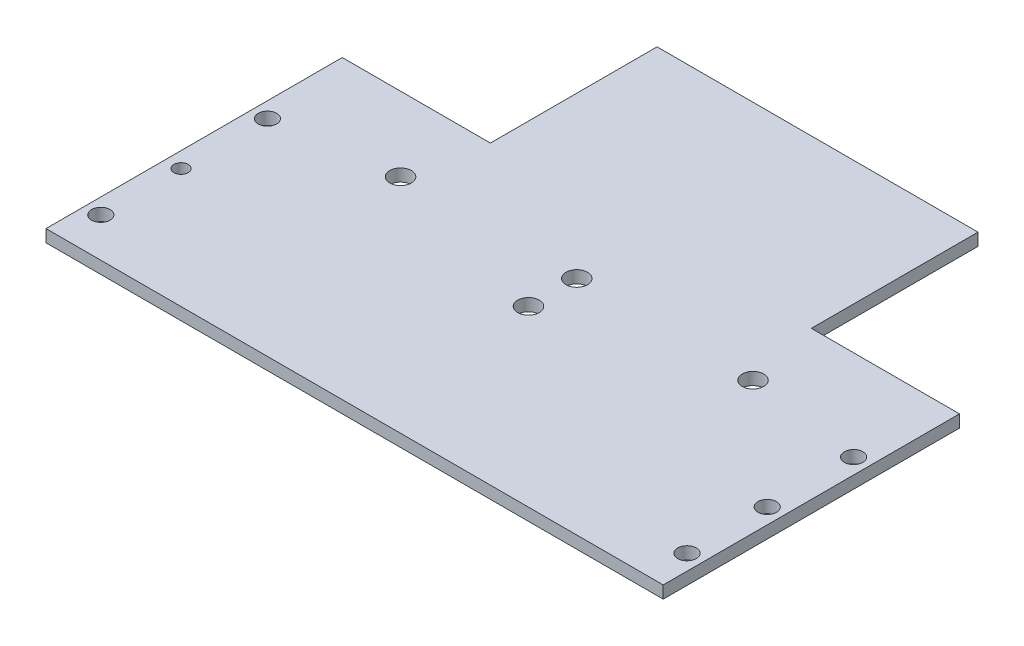
ISO-10303-21;
HEADER;
FILE_DESCRIPTION(('STEP AP214'),'2;1');
FILE_NAME('part.step','',(''),(''),'','','');
FILE_SCHEMA(('AUTOMOTIVE_DESIGN { 1 0 10303 214 1 1 1 1 }'));
ENDSEC;
DATA;
#1=APPLICATION_CONTEXT('core data for automotive mechanical design processes');
#2=APPLICATION_PROTOCOL_DEFINITION('international standard','automotive_design',2000,#1);
#3=PRODUCT_CONTEXT('',#1,'mechanical');
#4=PRODUCT('Part','Part','',(#3));
#5=PRODUCT_RELATED_PRODUCT_CATEGORY('part','',(#4));
#6=PRODUCT_DEFINITION_FORMATION('','',#4);
#7=PRODUCT_DEFINITION_CONTEXT('part definition',#1,'design');
#8=PRODUCT_DEFINITION('design','',#6,#7);
#9=PRODUCT_DEFINITION_SHAPE('','',#8);
#10=(LENGTH_UNIT() NAMED_UNIT(*) SI_UNIT(.MILLI.,.METRE.));
#11=(NAMED_UNIT(*) PLANE_ANGLE_UNIT() SI_UNIT($,.RADIAN.));
#12=(NAMED_UNIT(*) SI_UNIT($,.STERADIAN.) SOLID_ANGLE_UNIT());
#13=UNCERTAINTY_MEASURE_WITH_UNIT(LENGTH_MEASURE(1.E-05),#10,'distance_accuracy_value','');
#14=(GEOMETRIC_REPRESENTATION_CONTEXT(3) GLOBAL_UNCERTAINTY_ASSIGNED_CONTEXT((#13)) GLOBAL_UNIT_ASSIGNED_CONTEXT((#10,
#11,#12)) REPRESENTATION_CONTEXT('',''));
#15=CARTESIAN_POINT('',(0.,0.,0.));
#16=DIRECTION('',(0.,0.,1.));
#17=DIRECTION('',(1.,0.,0.));
#18=AXIS2_PLACEMENT_3D('',#15,#16,#17);
#19=CARTESIAN_POINT('',(50.,2.,0.));
#20=DIRECTION('',(1.,0.,0.));
#21=DIRECTION('',(0.,0.,-1.));
#22=AXIS2_PLACEMENT_3D('',#19,#20,#21);
#23=PLANE('',#22);
#24=DIRECTION('',(0.,0.,1.));
#25=VECTOR('',#24,1.);
#26=CARTESIAN_POINT('',(50.,0.,0.));
#27=LINE('',#26,#25);
#28=CARTESIAN_POINT('',(50.,0.,-10.5));
#29=VERTEX_POINT('',#28);
#30=CARTESIAN_POINT('',(50.,0.,37.5));
#31=VERTEX_POINT('',#30);
#32=EDGE_CURVE('E164',#29,#31,#27,.T.);
#33=ORIENTED_EDGE('',*,*,#32,.F.);
#34=DIRECTION('',(0.,-1.,0.));
#35=VECTOR('',#34,1.);
#36=CARTESIAN_POINT('',(50.,2.,-10.5));
#37=LINE('',#36,#35);
#38=CARTESIAN_POINT('',(50.,2.,-10.5));
#39=VERTEX_POINT('',#38);
#40=EDGE_CURVE('E11',#39,#29,#37,.T.);
#41=ORIENTED_EDGE('',*,*,#40,.F.);
#42=DIRECTION('',(0.,0.,1.));
#43=VECTOR('',#42,1.);
#44=CARTESIAN_POINT('',(50.,2.,0.));
#45=LINE('',#44,#43);
#46=CARTESIAN_POINT('',(50.,2.,37.5));
#47=VERTEX_POINT('',#46);
#48=EDGE_CURVE('E422',#39,#47,#45,.T.);
#49=ORIENTED_EDGE('',*,*,#48,.T.);
#50=DIRECTION('',(0.,-1.,0.));
#51=VECTOR('',#50,1.);
#52=CARTESIAN_POINT('',(50.,2.,37.5));
#53=LINE('',#52,#51);
#54=EDGE_CURVE('E87',#47,#31,#53,.T.);
#55=ORIENTED_EDGE('',*,*,#54,.T.);
#56=EDGE_LOOP('',(#33,#41,#49,#55));
#57=FACE_BOUND('',#56,.T.);
#58=ADVANCED_FACE('F35',(#57),#23,.T.);
#59=CARTESIAN_POINT('',(0.,2.,-10.5));
#60=DIRECTION('',(0.,0.,1.));
#61=DIRECTION('',(1.,0.,0.));
#62=AXIS2_PLACEMENT_3D('',#59,#60,#61);
#63=PLANE('',#62);
#64=DIRECTION('',(-1.,0.,0.));
#65=VECTOR('',#64,1.);
#66=CARTESIAN_POINT('',(0.,0.,-10.5));
#67=LINE('',#66,#65);
#68=CARTESIAN_POINT('',(26.,0.,-10.5));
#69=VERTEX_POINT('',#68);
#70=EDGE_CURVE('E166',#29,#69,#67,.T.);
#71=ORIENTED_EDGE('',*,*,#70,.T.);
#72=DIRECTION('',(0.,-1.,0.));
#73=VECTOR('',#72,1.);
#74=CARTESIAN_POINT('',(26.,2.,-10.5));
#75=LINE('',#74,#73);
#76=CARTESIAN_POINT('',(26.,2.,-10.5));
#77=VERTEX_POINT('',#76);
#78=EDGE_CURVE('E44',#77,#69,#75,.T.);
#79=ORIENTED_EDGE('',*,*,#78,.F.);
#80=DIRECTION('',(-1.,0.,0.));
#81=VECTOR('',#80,1.);
#82=CARTESIAN_POINT('',(0.,2.,-10.5));
#83=LINE('',#82,#81);
#84=EDGE_CURVE('E418',#39,#77,#83,.T.);
#85=ORIENTED_EDGE('',*,*,#84,.F.);
#86=ORIENTED_EDGE('',*,*,#40,.T.);
#87=EDGE_LOOP('',(#71,#79,#85,#86));
#88=FACE_BOUND('',#87,.T.);
#89=ADVANCED_FACE('F198',(#88),#63,.F.);
#90=CARTESIAN_POINT('',(26.,2.,0.));
#91=DIRECTION('',(-1.,0.,0.));
#92=DIRECTION('',(0.,0.,1.));
#93=AXIS2_PLACEMENT_3D('',#90,#91,#92);
#94=PLANE('',#93);
#95=DIRECTION('',(0.,0.,-1.));
#96=VECTOR('',#95,1.);
#97=CARTESIAN_POINT('',(26.,0.,0.));
#98=LINE('',#97,#96);
#99=CARTESIAN_POINT('',(26.,0.,-37.5));
#100=VERTEX_POINT('',#99);
#101=EDGE_CURVE('E169',#69,#100,#98,.T.);
#102=ORIENTED_EDGE('',*,*,#101,.T.);
#103=DIRECTION('',(0.,-1.,0.));
#104=VECTOR('',#103,1.);
#105=CARTESIAN_POINT('',(26.,2.,-37.5));
#106=LINE('',#105,#104);
#107=CARTESIAN_POINT('',(26.,2.,-37.5));
#108=VERTEX_POINT('',#107);
#109=EDGE_CURVE('E188',#108,#100,#106,.T.);
#110=ORIENTED_EDGE('',*,*,#109,.F.);
#111=DIRECTION('',(0.,0.,-1.));
#112=VECTOR('',#111,1.);
#113=CARTESIAN_POINT('',(26.,2.,0.));
#114=LINE('',#113,#112);
#115=EDGE_CURVE('E194',#77,#108,#114,.T.);
#116=ORIENTED_EDGE('',*,*,#115,.F.);
#117=ORIENTED_EDGE('',*,*,#78,.T.);
#118=EDGE_LOOP('',(#102,#110,#116,#117));
#119=FACE_BOUND('',#118,.T.);
#120=ADVANCED_FACE('F192',(#119),#94,.F.);
#121=CARTESIAN_POINT('',(0.,2.,-37.5));
#122=DIRECTION('',(0.,0.,-1.));
#123=DIRECTION('',(-1.,0.,0.));
#124=AXIS2_PLACEMENT_3D('',#121,#122,#123);
#125=PLANE('',#124);
#126=DIRECTION('',(1.,0.,0.));
#127=VECTOR('',#126,1.);
#128=CARTESIAN_POINT('',(0.,0.,-37.5));
#129=LINE('',#128,#127);
#130=CARTESIAN_POINT('',(-26.,0.,-37.5));
#131=VERTEX_POINT('',#130);
#132=EDGE_CURVE('E172',#131,#100,#129,.T.);
#133=ORIENTED_EDGE('',*,*,#132,.F.);
#134=DIRECTION('',(0.,-1.,0.));
#135=VECTOR('',#134,1.);
#136=CARTESIAN_POINT('',(-26.,2.,-37.5));
#137=LINE('',#136,#135);
#138=CARTESIAN_POINT('',(-26.,2.,-37.5));
#139=VERTEX_POINT('',#138);
#140=EDGE_CURVE('E186',#139,#131,#137,.T.);
#141=ORIENTED_EDGE('',*,*,#140,.F.);
#142=DIRECTION('',(1.,0.,0.));
#143=VECTOR('',#142,1.);
#144=CARTESIAN_POINT('',(0.,2.,-37.5));
#145=LINE('',#144,#143);
#146=EDGE_CURVE('E129',#139,#108,#145,.T.);
#147=ORIENTED_EDGE('',*,*,#146,.T.);
#148=ORIENTED_EDGE('',*,*,#109,.T.);
#149=EDGE_LOOP('',(#133,#141,#147,#148));
#150=FACE_BOUND('',#149,.T.);
#151=ADVANCED_FACE('F296',(#150),#125,.T.);
#152=CARTESIAN_POINT('',(-26.,2.,0.));
#153=DIRECTION('',(-1.,0.,0.));
#154=DIRECTION('',(0.,0.,1.));
#155=AXIS2_PLACEMENT_3D('',#152,#153,#154);
#156=PLANE('',#155);
#157=DIRECTION('',(0.,0.,-1.));
#158=VECTOR('',#157,1.);
#159=CARTESIAN_POINT('',(-26.,0.,0.));
#160=LINE('',#159,#158);
#161=CARTESIAN_POINT('',(-26.,0.,-10.5));
#162=VERTEX_POINT('',#161);
#163=EDGE_CURVE('E175',#162,#131,#160,.T.);
#164=ORIENTED_EDGE('',*,*,#163,.F.);
#165=DIRECTION('',(0.,-1.,0.));
#166=VECTOR('',#165,1.);
#167=CARTESIAN_POINT('',(-26.,2.,-10.5));
#168=LINE('',#167,#166);
#169=CARTESIAN_POINT('',(-26.,2.,-10.5));
#170=VERTEX_POINT('',#169);
#171=EDGE_CURVE('E116',#170,#162,#168,.T.);
#172=ORIENTED_EDGE('',*,*,#171,.F.);
#173=DIRECTION('',(0.,0.,-1.));
#174=VECTOR('',#173,1.);
#175=CARTESIAN_POINT('',(-26.,2.,0.));
#176=LINE('',#175,#174);
#177=EDGE_CURVE('E127',#170,#139,#176,.T.);
#178=ORIENTED_EDGE('',*,*,#177,.T.);
#179=ORIENTED_EDGE('',*,*,#140,.T.);
#180=EDGE_LOOP('',(#164,#172,#178,#179));
#181=FACE_BOUND('',#180,.T.);
#182=ADVANCED_FACE('F293',(#181),#156,.T.);
#183=CARTESIAN_POINT('',(0.,2.,-10.5));
#184=DIRECTION('',(0.,0.,-1.));
#185=DIRECTION('',(-1.,0.,0.));
#186=AXIS2_PLACEMENT_3D('',#183,#184,#185);
#187=PLANE('',#186);
#188=DIRECTION('',(1.,0.,0.));
#189=VECTOR('',#188,1.);
#190=CARTESIAN_POINT('',(0.,0.,-10.5));
#191=LINE('',#190,#189);
#192=CARTESIAN_POINT('',(-50.,0.,-10.5));
#193=VERTEX_POINT('',#192);
#194=EDGE_CURVE('E113',#193,#162,#191,.T.);
#195=ORIENTED_EDGE('',*,*,#194,.F.);
#196=DIRECTION('',(0.,-1.,0.));
#197=VECTOR('',#196,1.);
#198=CARTESIAN_POINT('',(-50.,2.,-10.5));
#199=LINE('',#198,#197);
#200=CARTESIAN_POINT('',(-50.,2.,-10.5));
#201=VERTEX_POINT('',#200);
#202=EDGE_CURVE('E107',#201,#193,#199,.T.);
#203=ORIENTED_EDGE('',*,*,#202,.F.);
#204=DIRECTION('',(1.,0.,0.));
#205=VECTOR('',#204,1.);
#206=CARTESIAN_POINT('',(0.,2.,-10.5));
#207=LINE('',#206,#205);
#208=EDGE_CURVE('E111',#201,#170,#207,.T.);
#209=ORIENTED_EDGE('',*,*,#208,.T.);
#210=ORIENTED_EDGE('',*,*,#171,.T.);
#211=EDGE_LOOP('',(#195,#203,#209,#210));
#212=FACE_BOUND('',#211,.T.);
#213=ADVANCED_FACE('F109',(#212),#187,.T.);
#214=CARTESIAN_POINT('',(-50.,2.,0.));
#215=DIRECTION('',(1.,0.,0.));
#216=DIRECTION('',(0.,0.,-1.));
#217=AXIS2_PLACEMENT_3D('',#214,#215,#216);
#218=PLANE('',#217);
#219=DIRECTION('',(0.,0.,1.));
#220=VECTOR('',#219,1.);
#221=CARTESIAN_POINT('',(-50.,0.,0.));
#222=LINE('',#221,#220);
#223=CARTESIAN_POINT('',(-50.,0.,37.5));
#224=VERTEX_POINT('',#223);
#225=EDGE_CURVE('E179',#193,#224,#222,.T.);
#226=ORIENTED_EDGE('',*,*,#225,.T.);
#227=DIRECTION('',(0.,-1.,0.));
#228=VECTOR('',#227,1.);
#229=CARTESIAN_POINT('',(-50.,2.,37.5));
#230=LINE('',#229,#228);
#231=CARTESIAN_POINT('',(-50.,2.,37.5));
#232=VERTEX_POINT('',#231);
#233=EDGE_CURVE('E117',#232,#224,#230,.T.);
#234=ORIENTED_EDGE('',*,*,#233,.F.);
#235=DIRECTION('',(0.,0.,1.));
#236=VECTOR('',#235,1.);
#237=CARTESIAN_POINT('',(-50.,2.,0.));
#238=LINE('',#237,#236);
#239=EDGE_CURVE('E120',#201,#232,#238,.T.);
#240=ORIENTED_EDGE('',*,*,#239,.F.);
#241=ORIENTED_EDGE('',*,*,#202,.T.);
#242=EDGE_LOOP('',(#226,#234,#240,#241));
#243=FACE_BOUND('',#242,.T.);
#244=ADVANCED_FACE('F121',(#243),#218,.F.);
#245=CARTESIAN_POINT('',(28.5500000000003,2.,1.50405140920961));
#246=DIRECTION('',(0.,-1.,0.));
#247=DIRECTION('',(0.,0.,-1.));
#248=AXIS2_PLACEMENT_3D('',#245,#246,#247);
#249=CYLINDRICAL_SURFACE('',#248,1.75);
#250=CARTESIAN_POINT('',(28.5500000000003,2.,1.50405140920961));
#251=DIRECTION('',(0.,1.,0.));
#252=DIRECTION('',(0.,0.,1.));
#253=AXIS2_PLACEMENT_3D('',#250,#251,#252);
#254=CIRCLE('',#253,1.75);
#255=CARTESIAN_POINT('',(28.5500000000003,2.,3.25405140920961));
#256=VERTEX_POINT('',#255);
#257=EDGE_CURVE('E424',#256,#256,#254,.T.);
#258=ORIENTED_EDGE('',*,*,#257,.T.);
#259=EDGE_LOOP('',(#258));
#260=FACE_BOUND('',#259,.T.);
#261=CARTESIAN_POINT('',(28.5500000000003,0.,1.50405140920961));
#262=DIRECTION('',(0.,1.,0.));
#263=DIRECTION('',(0.,0.,1.));
#264=AXIS2_PLACEMENT_3D('',#261,#262,#263);
#265=CIRCLE('',#264,1.75);
#266=CARTESIAN_POINT('',(28.5500000000003,0.,3.25405140920961));
#267=VERTEX_POINT('',#266);
#268=EDGE_CURVE('E161',#267,#267,#265,.T.);
#269=ORIENTED_EDGE('',*,*,#268,.F.);
#270=EDGE_LOOP('',(#269));
#271=FACE_BOUND('',#270,.T.);
#272=ADVANCED_FACE('F208',(#260,#271),#249,.F.);
#273=CARTESIAN_POINT('',(-28.5499999999995,2.,1.50405140920921));
#274=DIRECTION('',(0.,-1.,0.));
#275=DIRECTION('',(0.,0.,-1.));
#276=AXIS2_PLACEMENT_3D('',#273,#274,#275);
#277=CYLINDRICAL_SURFACE('',#276,1.75);
#278=CARTESIAN_POINT('',(-28.5499999999995,2.,1.50405140920921));
#279=DIRECTION('',(0.,1.,0.));
#280=DIRECTION('',(0.,0.,1.));
#281=AXIS2_PLACEMENT_3D('',#278,#279,#280);
#282=CIRCLE('',#281,1.75);
#283=CARTESIAN_POINT('',(-28.5499999999995,2.,3.25405140920921));
#284=VERTEX_POINT('',#283);
#285=EDGE_CURVE('E427',#284,#284,#282,.T.);
#286=ORIENTED_EDGE('',*,*,#285,.T.);
#287=EDGE_LOOP('',(#286));
#288=FACE_BOUND('',#287,.T.);
#289=CARTESIAN_POINT('',(-28.5499999999995,0.,1.50405140920921));
#290=DIRECTION('',(0.,1.,0.));
#291=DIRECTION('',(0.,0.,1.));
#292=AXIS2_PLACEMENT_3D('',#289,#290,#291);
#293=CIRCLE('',#292,1.75);
#294=CARTESIAN_POINT('',(-28.5499999999995,0.,3.25405140920921));
#295=VERTEX_POINT('',#294);
#296=EDGE_CURVE('E158',#295,#295,#293,.T.);
#297=ORIENTED_EDGE('',*,*,#296,.F.);
#298=EDGE_LOOP('',(#297));
#299=FACE_BOUND('',#298,.T.);
#300=ADVANCED_FACE('F211',(#288,#299),#277,.F.);
#301=CARTESIAN_POINT('',(-7.31638898184509E-13,2.,1.50405140920959));
#302=DIRECTION('',(0.,-1.,0.));
#303=DIRECTION('',(0.,0.,-1.));
#304=AXIS2_PLACEMENT_3D('',#301,#302,#303);
#305=CYLINDRICAL_SURFACE('',#304,1.75000000000003);
#306=CARTESIAN_POINT('',(-7.31638898184509E-13,2.,1.50405140920959));
#307=DIRECTION('',(0.,1.,0.));
#308=DIRECTION('',(0.,0.,1.));
#309=AXIS2_PLACEMENT_3D('',#306,#307,#308);
#310=CIRCLE('',#309,1.75000000000003);
#311=CARTESIAN_POINT('',(-7.31638898184509E-13,2.,3.25405140920961));
#312=VERTEX_POINT('',#311);
#313=EDGE_CURVE('E430',#312,#312,#310,.T.);
#314=ORIENTED_EDGE('',*,*,#313,.T.);
#315=EDGE_LOOP('',(#314));
#316=FACE_BOUND('',#315,.T.);
#317=CARTESIAN_POINT('',(-7.31638898184509E-13,0.,1.50405140920959));
#318=DIRECTION('',(0.,1.,0.));
#319=DIRECTION('',(0.,0.,1.));
#320=AXIS2_PLACEMENT_3D('',#317,#318,#319);
#321=CIRCLE('',#320,1.75000000000003);
#322=CARTESIAN_POINT('',(-7.31638898184509E-13,0.,3.25405140920961));
#323=VERTEX_POINT('',#322);
#324=EDGE_CURVE('E155',#323,#323,#321,.T.);
#325=ORIENTED_EDGE('',*,*,#324,.F.);
#326=EDGE_LOOP('',(#325));
#327=FACE_BOUND('',#326,.T.);
#328=ADVANCED_FACE('F215',(#316,#327),#305,.F.);
#329=CARTESIAN_POINT('',(-7.8628221568319E-13,2.,9.32928548546939));
#330=DIRECTION('',(0.,-1.,0.));
#331=DIRECTION('',(0.,0.,-1.));
#332=AXIS2_PLACEMENT_3D('',#329,#330,#331);
#333=CYLINDRICAL_SURFACE('',#332,1.75000000000005);
#334=CARTESIAN_POINT('',(-7.8628221568319E-13,2.,9.32928548546939));
#335=DIRECTION('',(0.,1.,0.));
#336=DIRECTION('',(0.,0.,1.));
#337=AXIS2_PLACEMENT_3D('',#334,#335,#336);
#338=CIRCLE('',#337,1.75000000000005);
#339=CARTESIAN_POINT('',(-7.8628221568319E-13,2.,11.0792854854694));
#340=VERTEX_POINT('',#339);
#341=EDGE_CURVE('E433',#340,#340,#338,.T.);
#342=ORIENTED_EDGE('',*,*,#341,.T.);
#343=EDGE_LOOP('',(#342));
#344=FACE_BOUND('',#343,.T.);
#345=CARTESIAN_POINT('',(-7.8628221568319E-13,0.,9.32928548546939));
#346=DIRECTION('',(0.,1.,0.));
#347=DIRECTION('',(0.,0.,1.));
#348=AXIS2_PLACEMENT_3D('',#345,#346,#347);
#349=CIRCLE('',#348,1.75000000000005);
#350=CARTESIAN_POINT('',(-7.8628221568319E-13,0.,11.0792854854694));
#351=VERTEX_POINT('',#350);
#352=EDGE_CURVE('E152',#351,#351,#349,.T.);
#353=ORIENTED_EDGE('',*,*,#352,.F.);
#354=EDGE_LOOP('',(#353));
#355=FACE_BOUND('',#354,.T.);
#356=ADVANCED_FACE('F219',(#344,#355),#333,.F.);
#357=CARTESIAN_POINT('',(47.4844883349842,2.,18.1356294985509));
#358=DIRECTION('',(0.,-1.,0.));
#359=DIRECTION('',(0.,0.,-1.));
#360=AXIS2_PLACEMENT_3D('',#357,#358,#359);
#361=CYLINDRICAL_SURFACE('',#360,1.5);
#362=CARTESIAN_POINT('',(47.4844883349842,2.,18.1356294985509));
#363=DIRECTION('',(0.,1.,0.));
#364=DIRECTION('',(0.,0.,1.));
#365=AXIS2_PLACEMENT_3D('',#362,#363,#364);
#366=CIRCLE('',#365,1.5);
#367=CARTESIAN_POINT('',(47.4844883349842,2.,19.6356294985508));
#368=VERTEX_POINT('',#367);
#369=EDGE_CURVE('E436',#368,#368,#366,.T.);
#370=ORIENTED_EDGE('',*,*,#369,.T.);
#371=EDGE_LOOP('',(#370));
#372=FACE_BOUND('',#371,.T.);
#373=CARTESIAN_POINT('',(47.4844883349842,0.,18.1356294985509));
#374=DIRECTION('',(0.,1.,0.));
#375=DIRECTION('',(0.,0.,1.));
#376=AXIS2_PLACEMENT_3D('',#373,#374,#375);
#377=CIRCLE('',#376,1.5);
#378=CARTESIAN_POINT('',(47.4844883349842,0.,19.6356294985508));
#379=VERTEX_POINT('',#378);
#380=EDGE_CURVE('E149',#379,#379,#377,.T.);
#381=ORIENTED_EDGE('',*,*,#380,.F.);
#382=EDGE_LOOP('',(#381));
#383=FACE_BOUND('',#382,.T.);
#384=ADVANCED_FACE('F223',(#372,#383),#361,.F.);
#385=CARTESIAN_POINT('',(47.4844883349842,2.,31.1356294985508));
#386=DIRECTION('',(0.,-1.,0.));
#387=DIRECTION('',(0.,0.,-1.));
#388=AXIS2_PLACEMENT_3D('',#385,#386,#387);
#389=CYLINDRICAL_SURFACE('',#388,1.5);
#390=CARTESIAN_POINT('',(47.4844883349842,2.,31.1356294985508));
#391=DIRECTION('',(0.,1.,0.));
#392=DIRECTION('',(0.,0.,1.));
#393=AXIS2_PLACEMENT_3D('',#390,#391,#392);
#394=CIRCLE('',#393,1.5);
#395=CARTESIAN_POINT('',(47.4844883349842,2.,32.6356294985508));
#396=VERTEX_POINT('',#395);
#397=EDGE_CURVE('E439',#396,#396,#394,.T.);
#398=ORIENTED_EDGE('',*,*,#397,.T.);
#399=EDGE_LOOP('',(#398));
#400=FACE_BOUND('',#399,.T.);
#401=CARTESIAN_POINT('',(47.4844883349842,0.,31.1356294985508));
#402=DIRECTION('',(0.,1.,0.));
#403=DIRECTION('',(0.,0.,1.));
#404=AXIS2_PLACEMENT_3D('',#401,#402,#403);
#405=CIRCLE('',#404,1.5);
#406=CARTESIAN_POINT('',(47.4844883349842,0.,32.6356294985508));
#407=VERTEX_POINT('',#406);
#408=EDGE_CURVE('E146',#407,#407,#405,.T.);
#409=ORIENTED_EDGE('',*,*,#408,.F.);
#410=EDGE_LOOP('',(#409));
#411=FACE_BOUND('',#410,.T.);
#412=ADVANCED_FACE('F227',(#400,#411),#389,.F.);
#413=CARTESIAN_POINT('',(47.4844883349842,2.,4.13562949855085));
#414=DIRECTION('',(0.,-1.,0.));
#415=DIRECTION('',(0.,0.,-1.));
#416=AXIS2_PLACEMENT_3D('',#413,#414,#415);
#417=CYLINDRICAL_SURFACE('',#416,1.5);
#418=CARTESIAN_POINT('',(47.4844883349842,2.,4.13562949855085));
#419=DIRECTION('',(0.,1.,0.));
#420=DIRECTION('',(0.,0.,1.));
#421=AXIS2_PLACEMENT_3D('',#418,#419,#420);
#422=CIRCLE('',#421,1.5);
#423=CARTESIAN_POINT('',(47.4844883349842,2.,5.63562949855086));
#424=VERTEX_POINT('',#423);
#425=EDGE_CURVE('E442',#424,#424,#422,.T.);
#426=ORIENTED_EDGE('',*,*,#425,.T.);
#427=EDGE_LOOP('',(#426));
#428=FACE_BOUND('',#427,.T.);
#429=CARTESIAN_POINT('',(47.4844883349842,0.,4.13562949855085));
#430=DIRECTION('',(0.,1.,0.));
#431=DIRECTION('',(0.,0.,1.));
#432=AXIS2_PLACEMENT_3D('',#429,#430,#431);
#433=CIRCLE('',#432,1.5);
#434=CARTESIAN_POINT('',(47.4844883349842,0.,5.63562949855086));
#435=VERTEX_POINT('',#434);
#436=EDGE_CURVE('E143',#435,#435,#433,.T.);
#437=ORIENTED_EDGE('',*,*,#436,.F.);
#438=EDGE_LOOP('',(#437));
#439=FACE_BOUND('',#438,.T.);
#440=ADVANCED_FACE('F231',(#428,#439),#417,.F.);
#441=CARTESIAN_POINT('',(-47.4844883349843,2.,4.13562949855084));
#442=DIRECTION('',(0.,-1.,0.));
#443=DIRECTION('',(0.,0.,-1.));
#444=AXIS2_PLACEMENT_3D('',#441,#442,#443);
#445=CYLINDRICAL_SURFACE('',#444,1.5);
#446=CARTESIAN_POINT('',(-47.4844883349843,2.,4.13562949855084));
#447=DIRECTION('',(0.,1.,0.));
#448=DIRECTION('',(0.,0.,1.));
#449=AXIS2_PLACEMENT_3D('',#446,#447,#448);
#450=CIRCLE('',#449,1.5);
#451=CARTESIAN_POINT('',(-47.4844883349843,2.,5.63562949855084));
#452=VERTEX_POINT('',#451);
#453=EDGE_CURVE('E445',#452,#452,#450,.T.);
#454=ORIENTED_EDGE('',*,*,#453,.T.);
#455=EDGE_LOOP('',(#454));
#456=FACE_BOUND('',#455,.T.);
#457=CARTESIAN_POINT('',(-47.4844883349843,0.,4.13562949855084));
#458=DIRECTION('',(0.,1.,0.));
#459=DIRECTION('',(0.,0.,1.));
#460=AXIS2_PLACEMENT_3D('',#457,#458,#459);
#461=CIRCLE('',#460,1.5);
#462=CARTESIAN_POINT('',(-47.4844883349843,0.,5.63562949855084));
#463=VERTEX_POINT('',#462);
#464=EDGE_CURVE('E140',#463,#463,#461,.T.);
#465=ORIENTED_EDGE('',*,*,#464,.F.);
#466=EDGE_LOOP('',(#465));
#467=FACE_BOUND('',#466,.T.);
#468=ADVANCED_FACE('F235',(#456,#467),#445,.F.);
#469=CARTESIAN_POINT('',(-47.4844883349843,2.,18.1356294985508));
#470=DIRECTION('',(0.,-1.,0.));
#471=DIRECTION('',(0.,0.,-1.));
#472=AXIS2_PLACEMENT_3D('',#469,#470,#471);
#473=CYLINDRICAL_SURFACE('',#472,1.15884979886027);
#474=CARTESIAN_POINT('',(-47.4844883349843,2.,18.1356294985508));
#475=DIRECTION('',(0.,1.,0.));
#476=DIRECTION('',(0.,0.,1.));
#477=AXIS2_PLACEMENT_3D('',#474,#475,#476);
#478=CIRCLE('',#477,1.15884979886027);
#479=CARTESIAN_POINT('',(-47.4844883349843,2.,19.2944792974111));
#480=VERTEX_POINT('',#479);
#481=EDGE_CURVE('E250',#480,#480,#478,.T.);
#482=ORIENTED_EDGE('',*,*,#481,.T.);
#483=EDGE_LOOP('',(#482));
#484=FACE_BOUND('',#483,.T.);
#485=CARTESIAN_POINT('',(-47.4844883349843,0.,18.1356294985508));
#486=DIRECTION('',(0.,1.,0.));
#487=DIRECTION('',(0.,0.,1.));
#488=AXIS2_PLACEMENT_3D('',#485,#486,#487);
#489=CIRCLE('',#488,1.15884979886027);
#490=CARTESIAN_POINT('',(-47.4844883349843,0.,19.2944792974111));
#491=VERTEX_POINT('',#490);
#492=EDGE_CURVE('E137',#491,#491,#489,.T.);
#493=ORIENTED_EDGE('',*,*,#492,.F.);
#494=EDGE_LOOP('',(#493));
#495=FACE_BOUND('',#494,.T.);
#496=ADVANCED_FACE('F238',(#484,#495),#473,.F.);
#497=CARTESIAN_POINT('',(-47.4844883349843,2.,31.1356294985508));
#498=DIRECTION('',(0.,-1.,0.));
#499=DIRECTION('',(0.,0.,-1.));
#500=AXIS2_PLACEMENT_3D('',#497,#498,#499);
#501=CYLINDRICAL_SURFACE('',#500,1.5);
#502=CARTESIAN_POINT('',(-47.4844883349843,2.,31.1356294985508));
#503=DIRECTION('',(0.,1.,0.));
#504=DIRECTION('',(0.,0.,1.));
#505=AXIS2_PLACEMENT_3D('',#502,#503,#504);
#506=CIRCLE('',#505,1.5);
#507=CARTESIAN_POINT('',(-47.4844883349843,2.,32.6356294985508));
#508=VERTEX_POINT('',#507);
#509=EDGE_CURVE('E182',#508,#508,#506,.T.);
#510=ORIENTED_EDGE('',*,*,#509,.T.);
#511=EDGE_LOOP('',(#510));
#512=FACE_BOUND('',#511,.T.);
#513=CARTESIAN_POINT('',(-47.4844883349843,0.,31.1356294985508));
#514=DIRECTION('',(0.,1.,0.));
#515=DIRECTION('',(0.,0.,1.));
#516=AXIS2_PLACEMENT_3D('',#513,#514,#515);
#517=CIRCLE('',#516,1.5);
#518=CARTESIAN_POINT('',(-47.4844883349843,0.,32.6356294985508));
#519=VERTEX_POINT('',#518);
#520=EDGE_CURVE('E134',#519,#519,#517,.T.);
#521=ORIENTED_EDGE('',*,*,#520,.F.);
#522=EDGE_LOOP('',(#521));
#523=FACE_BOUND('',#522,.T.);
#524=ADVANCED_FACE('F37',(#512,#523),#501,.F.);
#525=CARTESIAN_POINT('',(0.,2.,37.5));
#526=DIRECTION('',(0.,0.,-1.));
#527=DIRECTION('',(-1.,0.,0.));
#528=AXIS2_PLACEMENT_3D('',#525,#526,#527);
#529=PLANE('',#528);
#530=DIRECTION('',(1.,0.,0.));
#531=VECTOR('',#530,1.);
#532=CARTESIAN_POINT('',(0.,0.,37.5));
#533=LINE('',#532,#531);
#534=EDGE_CURVE('E80',#224,#31,#533,.T.);
#535=ORIENTED_EDGE('',*,*,#534,.T.);
#536=ORIENTED_EDGE('',*,*,#54,.F.);
#537=DIRECTION('',(1.,0.,0.));
#538=VECTOR('',#537,1.);
#539=CARTESIAN_POINT('',(0.,2.,37.5));
#540=LINE('',#539,#538);
#541=EDGE_CURVE('E52',#232,#47,#540,.T.);
#542=ORIENTED_EDGE('',*,*,#541,.F.);
#543=ORIENTED_EDGE('',*,*,#233,.T.);
#544=EDGE_LOOP('',(#535,#536,#542,#543));
#545=FACE_BOUND('',#544,.T.);
#546=ADVANCED_FACE('F245',(#545),#529,.F.);
#547=CARTESIAN_POINT('',(0.,2.,0.));
#548=DIRECTION('',(0.,1.,0.));
#549=DIRECTION('',(0.,0.,1.));
#550=AXIS2_PLACEMENT_3D('',#547,#548,#549);
#551=PLANE('',#550);
#552=ORIENTED_EDGE('',*,*,#509,.F.);
#553=EDGE_LOOP('',(#552));
#554=FACE_BOUND('',#553,.T.);
#555=ORIENTED_EDGE('',*,*,#481,.F.);
#556=EDGE_LOOP('',(#555));
#557=FACE_BOUND('',#556,.T.);
#558=ORIENTED_EDGE('',*,*,#453,.F.);
#559=EDGE_LOOP('',(#558));
#560=FACE_BOUND('',#559,.T.);
#561=ORIENTED_EDGE('',*,*,#425,.F.);
#562=EDGE_LOOP('',(#561));
#563=FACE_BOUND('',#562,.T.);
#564=ORIENTED_EDGE('',*,*,#397,.F.);
#565=EDGE_LOOP('',(#564));
#566=FACE_BOUND('',#565,.T.);
#567=ORIENTED_EDGE('',*,*,#369,.F.);
#568=EDGE_LOOP('',(#567));
#569=FACE_BOUND('',#568,.T.);
#570=ORIENTED_EDGE('',*,*,#341,.F.);
#571=EDGE_LOOP('',(#570));
#572=FACE_BOUND('',#571,.T.);
#573=ORIENTED_EDGE('',*,*,#313,.F.);
#574=EDGE_LOOP('',(#573));
#575=FACE_BOUND('',#574,.T.);
#576=ORIENTED_EDGE('',*,*,#285,.F.);
#577=EDGE_LOOP('',(#576));
#578=FACE_BOUND('',#577,.T.);
#579=ORIENTED_EDGE('',*,*,#257,.F.);
#580=EDGE_LOOP('',(#579));
#581=FACE_BOUND('',#580,.T.);
#582=ORIENTED_EDGE('',*,*,#48,.F.);
#583=ORIENTED_EDGE('',*,*,#84,.T.);
#584=ORIENTED_EDGE('',*,*,#115,.T.);
#585=ORIENTED_EDGE('',*,*,#146,.F.);
#586=ORIENTED_EDGE('',*,*,#177,.F.);
#587=ORIENTED_EDGE('',*,*,#208,.F.);
#588=ORIENTED_EDGE('',*,*,#239,.T.);
#589=ORIENTED_EDGE('',*,*,#541,.T.);
#590=EDGE_LOOP('',(#582,#583,#584,#585,#586,#587,#588,#589));
#591=FACE_BOUND('',#590,.T.);
#592=ADVANCED_FACE('F124',(#554,#557,#560,#563,#566,#569,#572,#575,#578,#581,#591),#551,.T.);
#593=CARTESIAN_POINT('',(0.,0.,0.));
#594=DIRECTION('',(0.,1.,0.));
#595=DIRECTION('',(0.,0.,1.));
#596=AXIS2_PLACEMENT_3D('',#593,#594,#595);
#597=PLANE('',#596);
#598=ORIENTED_EDGE('',*,*,#520,.T.);
#599=EDGE_LOOP('',(#598));
#600=FACE_BOUND('',#599,.T.);
#601=ORIENTED_EDGE('',*,*,#492,.T.);
#602=EDGE_LOOP('',(#601));
#603=FACE_BOUND('',#602,.T.);
#604=ORIENTED_EDGE('',*,*,#464,.T.);
#605=EDGE_LOOP('',(#604));
#606=FACE_BOUND('',#605,.T.);
#607=ORIENTED_EDGE('',*,*,#436,.T.);
#608=EDGE_LOOP('',(#607));
#609=FACE_BOUND('',#608,.T.);
#610=ORIENTED_EDGE('',*,*,#408,.T.);
#611=EDGE_LOOP('',(#610));
#612=FACE_BOUND('',#611,.T.);
#613=ORIENTED_EDGE('',*,*,#380,.T.);
#614=EDGE_LOOP('',(#613));
#615=FACE_BOUND('',#614,.T.);
#616=ORIENTED_EDGE('',*,*,#352,.T.);
#617=EDGE_LOOP('',(#616));
#618=FACE_BOUND('',#617,.T.);
#619=ORIENTED_EDGE('',*,*,#324,.T.);
#620=EDGE_LOOP('',(#619));
#621=FACE_BOUND('',#620,.T.);
#622=ORIENTED_EDGE('',*,*,#296,.T.);
#623=EDGE_LOOP('',(#622));
#624=FACE_BOUND('',#623,.T.);
#625=ORIENTED_EDGE('',*,*,#268,.T.);
#626=EDGE_LOOP('',(#625));
#627=FACE_BOUND('',#626,.T.);
#628=ORIENTED_EDGE('',*,*,#32,.T.);
#629=ORIENTED_EDGE('',*,*,#534,.F.);
#630=ORIENTED_EDGE('',*,*,#225,.F.);
#631=ORIENTED_EDGE('',*,*,#194,.T.);
#632=ORIENTED_EDGE('',*,*,#163,.T.);
#633=ORIENTED_EDGE('',*,*,#132,.T.);
#634=ORIENTED_EDGE('',*,*,#101,.F.);
#635=ORIENTED_EDGE('',*,*,#70,.F.);
#636=EDGE_LOOP('',(#628,#629,#630,#631,#632,#633,#634,#635));
#637=FACE_BOUND('',#636,.T.);
#638=ADVANCED_FACE('F199',(#600,#603,#606,#609,#612,#615,#618,#621,#624,#627,#637),#597,.F.);
#639=CLOSED_SHELL('',(#58,#89,#120,#151,#182,#213,#244,#272,#300,#328,#356,#384,#412,#440,#468,
#496,#524,#546,#592,#638));
#640=MANIFOLD_SOLID_BREP('B2',#639);
#641=ADVANCED_BREP_SHAPE_REPRESENTATION('',(#18,#640),#14);
#642=SHAPE_DEFINITION_REPRESENTATION(#9,#641);
ENDSEC;
END-ISO-10303-21;
